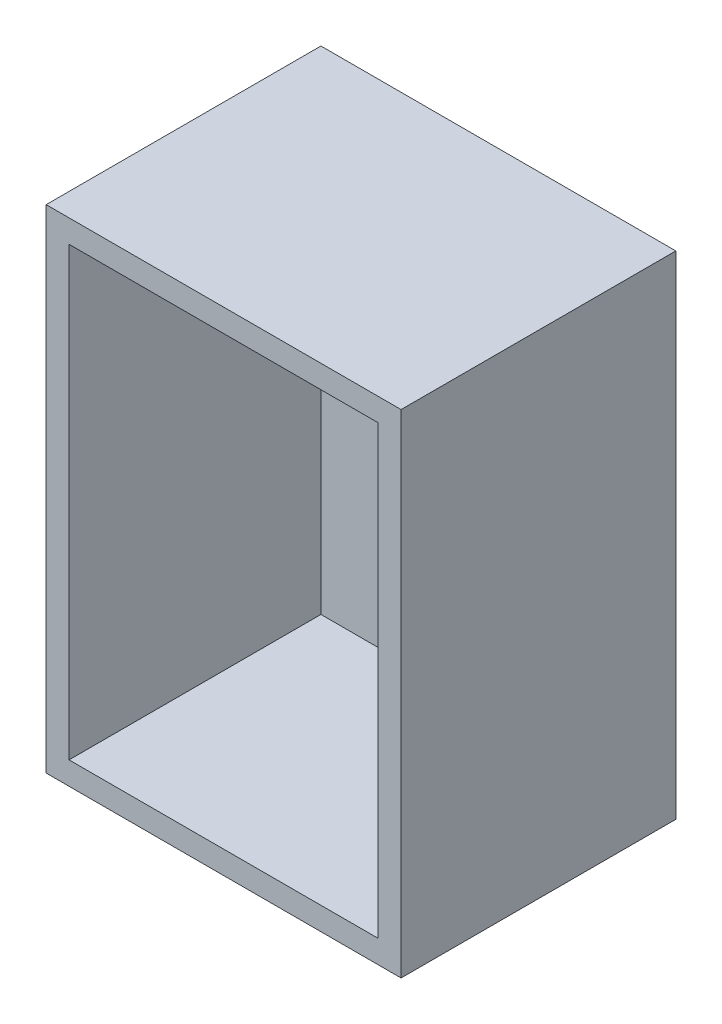
ISO-10303-21;
HEADER;
FILE_DESCRIPTION(('STEP AP214'),'2;1');
FILE_NAME('part.step','',(''),(''),'','','');
FILE_SCHEMA(('AUTOMOTIVE_DESIGN { 1 0 10303 214 1 1 1 1 }'));
ENDSEC;
DATA;
#1=APPLICATION_CONTEXT('core data for automotive mechanical design processes');
#2=APPLICATION_PROTOCOL_DEFINITION('international standard','automotive_design',2000,#1);
#3=PRODUCT_CONTEXT('',#1,'mechanical');
#4=PRODUCT('Part','Part','',(#3));
#5=PRODUCT_RELATED_PRODUCT_CATEGORY('part','',(#4));
#6=PRODUCT_DEFINITION_FORMATION('','',#4);
#7=PRODUCT_DEFINITION_CONTEXT('part definition',#1,'design');
#8=PRODUCT_DEFINITION('design','',#6,#7);
#9=PRODUCT_DEFINITION_SHAPE('','',#8);
#10=(LENGTH_UNIT() NAMED_UNIT(*) SI_UNIT(.MILLI.,.METRE.));
#11=(NAMED_UNIT(*) PLANE_ANGLE_UNIT() SI_UNIT($,.RADIAN.));
#12=(NAMED_UNIT(*) SI_UNIT($,.STERADIAN.) SOLID_ANGLE_UNIT());
#13=UNCERTAINTY_MEASURE_WITH_UNIT(LENGTH_MEASURE(1.E-05),#10,'distance_accuracy_value','');
#14=(GEOMETRIC_REPRESENTATION_CONTEXT(3) GLOBAL_UNCERTAINTY_ASSIGNED_CONTEXT((#13)) GLOBAL_UNIT_ASSIGNED_CONTEXT((#10,
#11,#12)) REPRESENTATION_CONTEXT('',''));
#15=CARTESIAN_POINT('',(0.,0.,0.));
#16=DIRECTION('',(0.,0.,1.));
#17=DIRECTION('',(1.,0.,0.));
#18=AXIS2_PLACEMENT_3D('',#15,#16,#17);
#19=CARTESIAN_POINT('',(433.24935414059,907.246562718976,72.9522135152235));
#20=DIRECTION('',(0.,0.,-1.));
#21=DIRECTION('',(-1.,0.,0.));
#22=AXIS2_PLACEMENT_3D('',#19,#20,#21);
#23=PLANE('',#22);
#24=DIRECTION('',(1.,0.,0.));
#25=VECTOR('',#24,1.);
#26=CARTESIAN_POINT('',(334.814354140591,907.256562718979,72.9522135152235));
#27=LINE('',#26,#25);
#28=CARTESIAN_POINT('',(236.389354140591,907.256562718979,72.9522135152235));
#29=VERTEX_POINT('',#28);
#30=CARTESIAN_POINT('',(433.23935414059,907.256562718979,72.9522135152235));
#31=VERTEX_POINT('',#30);
#32=EDGE_CURVE('E93',#29,#31,#27,.T.);
#33=ORIENTED_EDGE('',*,*,#32,.F.);
#34=DIRECTION('',(0.,-1.,0.));
#35=VECTOR('',#34,1.);
#36=CARTESIAN_POINT('',(236.389354140591,1043.78156271898,72.9522135152235));
#37=LINE('',#36,#35);
#38=CARTESIAN_POINT('',(236.389354140591,1180.30656271898,72.9522135152235));
#39=VERTEX_POINT('',#38);
#40=EDGE_CURVE('E80',#39,#29,#37,.T.);
#41=ORIENTED_EDGE('',*,*,#40,.F.);
#42=DIRECTION('',(-1.,0.,0.));
#43=VECTOR('',#42,1.);
#44=CARTESIAN_POINT('',(334.814354140591,1180.30656271898,72.9522135152235));
#45=LINE('',#44,#43);
#46=CARTESIAN_POINT('',(433.23935414059,1180.30656271898,72.9522135152235));
#47=VERTEX_POINT('',#46);
#48=EDGE_CURVE('E21',#47,#39,#45,.T.);
#49=ORIENTED_EDGE('',*,*,#48,.F.);
#50=DIRECTION('',(0.,1.,0.));
#51=VECTOR('',#50,1.);
#52=CARTESIAN_POINT('',(433.23935414059,1043.78156271898,72.9522135152235));
#53=LINE('',#52,#51);
#54=EDGE_CURVE('E108',#31,#47,#53,.T.);
#55=ORIENTED_EDGE('',*,*,#54,.F.);
#56=EDGE_LOOP('',(#33,#41,#49,#55));
#57=FACE_BOUND('',#56,.T.);
#58=ADVANCED_FACE('F17',(#57),#23,.T.);
#59=CARTESIAN_POINT('',(433.24935414059,1180.30656271898,72.9422135152233));
#60=DIRECTION('',(0.,1.,0.));
#61=DIRECTION('',(-1.,0.,0.));
#62=AXIS2_PLACEMENT_3D('',#59,#60,#61);
#63=PLANE('',#62);
#64=DIRECTION('',(0.,0.,1.));
#65=VECTOR('',#64,1.);
#66=CARTESIAN_POINT('',(433.23935414059,1180.30656271898,149.152213515223));
#67=LINE('',#66,#65);
#68=CARTESIAN_POINT('',(433.23935414059,1180.30656271898,225.352213515224));
#69=VERTEX_POINT('',#68);
#70=EDGE_CURVE('E89',#47,#69,#67,.T.);
#71=ORIENTED_EDGE('',*,*,#70,.F.);
#72=ORIENTED_EDGE('',*,*,#48,.T.);
#73=DIRECTION('',(0.,0.,-1.));
#74=VECTOR('',#73,1.);
#75=CARTESIAN_POINT('',(236.389354140591,1180.30656271898,149.152213515223));
#76=LINE('',#75,#74);
#77=CARTESIAN_POINT('',(236.389354140591,1180.30656271898,225.352213515224));
#78=VERTEX_POINT('',#77);
#79=EDGE_CURVE('E86',#78,#39,#76,.T.);
#80=ORIENTED_EDGE('',*,*,#79,.F.);
#81=DIRECTION('',(-1.,0.,0.));
#82=VECTOR('',#81,1.);
#83=CARTESIAN_POINT('',(334.814354140591,1180.30656271898,225.352213515224));
#84=LINE('',#83,#82);
#85=EDGE_CURVE('E110',#69,#78,#84,.T.);
#86=ORIENTED_EDGE('',*,*,#85,.F.);
#87=EDGE_LOOP('',(#71,#72,#80,#86));
#88=FACE_BOUND('',#87,.T.);
#89=ADVANCED_FACE('F85',(#88),#63,.T.);
#90=CARTESIAN_POINT('',(236.389354140591,1180.31656271898,72.9422135152233));
#91=DIRECTION('',(-1.,0.,0.));
#92=DIRECTION('',(0.,-1.,0.));
#93=AXIS2_PLACEMENT_3D('',#90,#91,#92);
#94=PLANE('',#93);
#95=ORIENTED_EDGE('',*,*,#79,.T.);
#96=ORIENTED_EDGE('',*,*,#40,.T.);
#97=DIRECTION('',(0.,0.,-1.));
#98=VECTOR('',#97,1.);
#99=CARTESIAN_POINT('',(236.389354140591,907.256562718979,149.152213515223));
#100=LINE('',#99,#98);
#101=CARTESIAN_POINT('',(236.389354140591,907.256562718979,225.352213515224));
#102=VERTEX_POINT('',#101);
#103=EDGE_CURVE('E95',#102,#29,#100,.T.);
#104=ORIENTED_EDGE('',*,*,#103,.F.);
#105=DIRECTION('',(0.,-1.,0.));
#106=VECTOR('',#105,1.);
#107=CARTESIAN_POINT('',(236.389354140591,1043.78156271898,225.352213515224));
#108=LINE('',#107,#106);
#109=EDGE_CURVE('E99',#78,#102,#108,.T.);
#110=ORIENTED_EDGE('',*,*,#109,.F.);
#111=EDGE_LOOP('',(#95,#96,#104,#110));
#112=FACE_BOUND('',#111,.T.);
#113=ADVANCED_FACE('F97',(#112),#94,.T.);
#114=CARTESIAN_POINT('',(236.379354140591,907.256562718979,72.9422135152233));
#115=DIRECTION('',(0.,-1.,0.));
#116=DIRECTION('',(1.,0.,0.));
#117=AXIS2_PLACEMENT_3D('',#114,#115,#116);
#118=PLANE('',#117);
#119=ORIENTED_EDGE('',*,*,#103,.T.);
#120=ORIENTED_EDGE('',*,*,#32,.T.);
#121=DIRECTION('',(0.,0.,-1.));
#122=VECTOR('',#121,1.);
#123=CARTESIAN_POINT('',(433.23935414059,907.256562718979,149.152213515223));
#124=LINE('',#123,#122);
#125=CARTESIAN_POINT('',(433.23935414059,907.256562718979,225.352213515224));
#126=VERTEX_POINT('',#125);
#127=EDGE_CURVE('E105',#126,#31,#124,.T.);
#128=ORIENTED_EDGE('',*,*,#127,.F.);
#129=DIRECTION('',(1.,0.,0.));
#130=VECTOR('',#129,1.);
#131=CARTESIAN_POINT('',(334.814354140591,907.256562718979,225.352213515224));
#132=LINE('',#131,#130);
#133=EDGE_CURVE('E113',#102,#126,#132,.T.);
#134=ORIENTED_EDGE('',*,*,#133,.F.);
#135=EDGE_LOOP('',(#119,#120,#128,#134));
#136=FACE_BOUND('',#135,.T.);
#137=ADVANCED_FACE('F212',(#136),#118,.T.);
#138=CARTESIAN_POINT('',(433.23935414059,907.246562718976,72.9422135152233));
#139=DIRECTION('',(1.,0.,0.));
#140=DIRECTION('',(0.,1.,0.));
#141=AXIS2_PLACEMENT_3D('',#138,#139,#140);
#142=PLANE('',#141);
#143=ORIENTED_EDGE('',*,*,#127,.T.);
#144=ORIENTED_EDGE('',*,*,#54,.T.);
#145=ORIENTED_EDGE('',*,*,#70,.T.);
#146=DIRECTION('',(0.,1.,0.));
#147=VECTOR('',#146,1.);
#148=CARTESIAN_POINT('',(433.23935414059,1043.78156271898,225.352213515224));
#149=LINE('',#148,#147);
#150=EDGE_CURVE('E116',#126,#69,#149,.T.);
#151=ORIENTED_EDGE('',*,*,#150,.F.);
#152=EDGE_LOOP('',(#143,#144,#145,#151));
#153=FACE_BOUND('',#152,.T.);
#154=ADVANCED_FACE('F169',(#153),#142,.T.);
#155=CARTESIAN_POINT('',(236.379354140591,907.246562718976,225.352213515224));
#156=DIRECTION('',(0.,0.,1.));
#157=DIRECTION('',(1.,0.,0.));
#158=AXIS2_PLACEMENT_3D('',#155,#156,#157);
#159=PLANE('',#158);
#160=DIRECTION('',(0.,-1.,0.));
#161=VECTOR('',#160,1.);
#162=CARTESIAN_POINT('',(249.089354140591,1043.78156271898,225.352213515224));
#163=LINE('',#162,#161);
#164=CARTESIAN_POINT('',(249.089354140591,1167.60656271898,225.352213515224));
#165=VERTEX_POINT('',#164);
#166=CARTESIAN_POINT('',(249.089354140591,919.956562718977,225.352213515224));
#167=VERTEX_POINT('',#166);
#168=EDGE_CURVE('E124',#165,#167,#163,.T.);
#169=ORIENTED_EDGE('',*,*,#168,.F.);
#170=DIRECTION('',(-1.,0.,0.));
#171=VECTOR('',#170,1.);
#172=CARTESIAN_POINT('',(334.814354140591,1167.60656271898,225.352213515224));
#173=LINE('',#172,#171);
#174=CARTESIAN_POINT('',(420.53935414059,1167.60656271898,225.352213515224));
#175=VERTEX_POINT('',#174);
#176=EDGE_CURVE('E119',#175,#165,#173,.T.);
#177=ORIENTED_EDGE('',*,*,#176,.F.);
#178=DIRECTION('',(0.,1.,0.));
#179=VECTOR('',#178,1.);
#180=CARTESIAN_POINT('',(420.53935414059,1043.78156271898,225.352213515224));
#181=LINE('',#180,#179);
#182=CARTESIAN_POINT('',(420.53935414059,919.956562718979,225.352213515224));
#183=VERTEX_POINT('',#182);
#184=EDGE_CURVE('E135',#183,#175,#181,.T.);
#185=ORIENTED_EDGE('',*,*,#184,.F.);
#186=DIRECTION('',(1.,0.,0.));
#187=VECTOR('',#186,1.);
#188=CARTESIAN_POINT('',(334.814354140591,919.956562718979,225.352213515224));
#189=LINE('',#188,#187);
#190=EDGE_CURVE('E129',#167,#183,#189,.T.);
#191=ORIENTED_EDGE('',*,*,#190,.F.);
#192=EDGE_LOOP('',(#169,#177,#185,#191));
#193=FACE_BOUND('',#192,.T.);
#194=ORIENTED_EDGE('',*,*,#133,.T.);
#195=ORIENTED_EDGE('',*,*,#150,.T.);
#196=ORIENTED_EDGE('',*,*,#85,.T.);
#197=ORIENTED_EDGE('',*,*,#109,.T.);
#198=EDGE_LOOP('',(#194,#195,#196,#197));
#199=FACE_BOUND('',#198,.T.);
#200=ADVANCED_FACE('F154',(#193,#199),#159,.T.);
#201=CARTESIAN_POINT('',(249.079354140591,1167.60656271898,85.6422135152235));
#202=DIRECTION('',(0.,-1.,0.));
#203=DIRECTION('',(1.,0.,0.));
#204=AXIS2_PLACEMENT_3D('',#201,#202,#203);
#205=PLANE('',#204);
#206=DIRECTION('',(0.,0.,-1.));
#207=VECTOR('',#206,1.);
#208=CARTESIAN_POINT('',(420.53935414059,1167.60656271898,155.502213515224));
#209=LINE('',#208,#207);
#210=CARTESIAN_POINT('',(420.53935414059,1167.60656271898,85.6522135152235));
#211=VERTEX_POINT('',#210);
#212=EDGE_CURVE('E131',#175,#211,#209,.T.);
#213=ORIENTED_EDGE('',*,*,#212,.F.);
#214=ORIENTED_EDGE('',*,*,#176,.T.);
#215=DIRECTION('',(0.,0.,1.));
#216=VECTOR('',#215,1.);
#217=CARTESIAN_POINT('',(249.089354140591,1167.60656271898,155.502213515224));
#218=LINE('',#217,#216);
#219=CARTESIAN_POINT('',(249.089354140591,1167.60656271898,85.6522135152235));
#220=VERTEX_POINT('',#219);
#221=EDGE_CURVE('E121',#220,#165,#218,.T.);
#222=ORIENTED_EDGE('',*,*,#221,.F.);
#223=DIRECTION('',(-1.,0.,0.));
#224=VECTOR('',#223,1.);
#225=CARTESIAN_POINT('',(334.814354140591,1167.60656271898,85.6522135152235));
#226=LINE('',#225,#224);
#227=EDGE_CURVE('E138',#211,#220,#226,.T.);
#228=ORIENTED_EDGE('',*,*,#227,.F.);
#229=EDGE_LOOP('',(#213,#214,#222,#228));
#230=FACE_BOUND('',#229,.T.);
#231=ADVANCED_FACE('F160',(#230),#205,.T.);
#232=CARTESIAN_POINT('',(249.089354140591,919.946562718976,85.6422135152235));
#233=DIRECTION('',(1.,0.,0.));
#234=DIRECTION('',(0.,1.,0.));
#235=AXIS2_PLACEMENT_3D('',#232,#233,#234);
#236=PLANE('',#235);
#237=ORIENTED_EDGE('',*,*,#221,.T.);
#238=ORIENTED_EDGE('',*,*,#168,.T.);
#239=DIRECTION('',(0.,0.,1.));
#240=VECTOR('',#239,1.);
#241=CARTESIAN_POINT('',(249.089354140591,919.956562718979,155.502213515224));
#242=LINE('',#241,#240);
#243=CARTESIAN_POINT('',(249.089354140591,919.956562718977,85.6522135152235));
#244=VERTEX_POINT('',#243);
#245=EDGE_CURVE('E126',#244,#167,#242,.T.);
#246=ORIENTED_EDGE('',*,*,#245,.F.);
#247=DIRECTION('',(0.,-1.,0.));
#248=VECTOR('',#247,1.);
#249=CARTESIAN_POINT('',(249.089354140591,1043.78156271898,85.6522135152235));
#250=LINE('',#249,#248);
#251=EDGE_CURVE('E141',#220,#244,#250,.T.);
#252=ORIENTED_EDGE('',*,*,#251,.F.);
#253=EDGE_LOOP('',(#237,#238,#246,#252));
#254=FACE_BOUND('',#253,.T.);
#255=ADVANCED_FACE('F151',(#254),#236,.T.);
#256=CARTESIAN_POINT('',(420.54935414059,919.956562718979,85.6422135152235));
#257=DIRECTION('',(0.,1.,0.));
#258=DIRECTION('',(-1.,0.,0.));
#259=AXIS2_PLACEMENT_3D('',#256,#257,#258);
#260=PLANE('',#259);
#261=ORIENTED_EDGE('',*,*,#245,.T.);
#262=ORIENTED_EDGE('',*,*,#190,.T.);
#263=DIRECTION('',(0.,0.,1.));
#264=VECTOR('',#263,1.);
#265=CARTESIAN_POINT('',(420.53935414059,919.956562718979,155.502213515224));
#266=LINE('',#265,#264);
#267=CARTESIAN_POINT('',(420.53935414059,919.956562718979,85.6522135152235));
#268=VERTEX_POINT('',#267);
#269=EDGE_CURVE('E36',#268,#183,#266,.T.);
#270=ORIENTED_EDGE('',*,*,#269,.F.);
#271=DIRECTION('',(1.,0.,0.));
#272=VECTOR('',#271,1.);
#273=CARTESIAN_POINT('',(334.814354140591,919.956562718979,85.6522135152235));
#274=LINE('',#273,#272);
#275=EDGE_CURVE('E27',#244,#268,#274,.T.);
#276=ORIENTED_EDGE('',*,*,#275,.F.);
#277=EDGE_LOOP('',(#261,#262,#270,#276));
#278=FACE_BOUND('',#277,.T.);
#279=ADVANCED_FACE('F147',(#278),#260,.T.);
#280=CARTESIAN_POINT('',(420.53935414059,1167.61656271898,85.6422135152235));
#281=DIRECTION('',(-1.,0.,0.));
#282=DIRECTION('',(0.,-1.,0.));
#283=AXIS2_PLACEMENT_3D('',#280,#281,#282);
#284=PLANE('',#283);
#285=ORIENTED_EDGE('',*,*,#269,.T.);
#286=ORIENTED_EDGE('',*,*,#184,.T.);
#287=ORIENTED_EDGE('',*,*,#212,.T.);
#288=DIRECTION('',(0.,1.,0.));
#289=VECTOR('',#288,1.);
#290=CARTESIAN_POINT('',(420.53935414059,1043.78156271898,85.6522135152235));
#291=LINE('',#290,#289);
#292=EDGE_CURVE('E11',#268,#211,#291,.T.);
#293=ORIENTED_EDGE('',*,*,#292,.F.);
#294=EDGE_LOOP('',(#285,#286,#287,#293));
#295=FACE_BOUND('',#294,.T.);
#296=ADVANCED_FACE('F158',(#295),#284,.T.);
#297=CARTESIAN_POINT('',(249.079354140591,919.946562718976,85.6522135152235));
#298=DIRECTION('',(0.,0.,1.));
#299=DIRECTION('',(1.,0.,0.));
#300=AXIS2_PLACEMENT_3D('',#297,#298,#299);
#301=PLANE('',#300);
#302=ORIENTED_EDGE('',*,*,#275,.T.);
#303=ORIENTED_EDGE('',*,*,#292,.T.);
#304=ORIENTED_EDGE('',*,*,#227,.T.);
#305=ORIENTED_EDGE('',*,*,#251,.T.);
#306=EDGE_LOOP('',(#302,#303,#304,#305));
#307=FACE_BOUND('',#306,.T.);
#308=ADVANCED_FACE('F19',(#307),#301,.T.);
#309=CLOSED_SHELL('',(#58,#89,#113,#137,#154,#200,#231,#255,#279,#296,#308));
#310=MANIFOLD_SOLID_BREP('B1',#309);
#311=ADVANCED_BREP_SHAPE_REPRESENTATION('',(#18,#310),#14);
#312=SHAPE_DEFINITION_REPRESENTATION(#9,#311);
ENDSEC;
END-ISO-10303-21;
